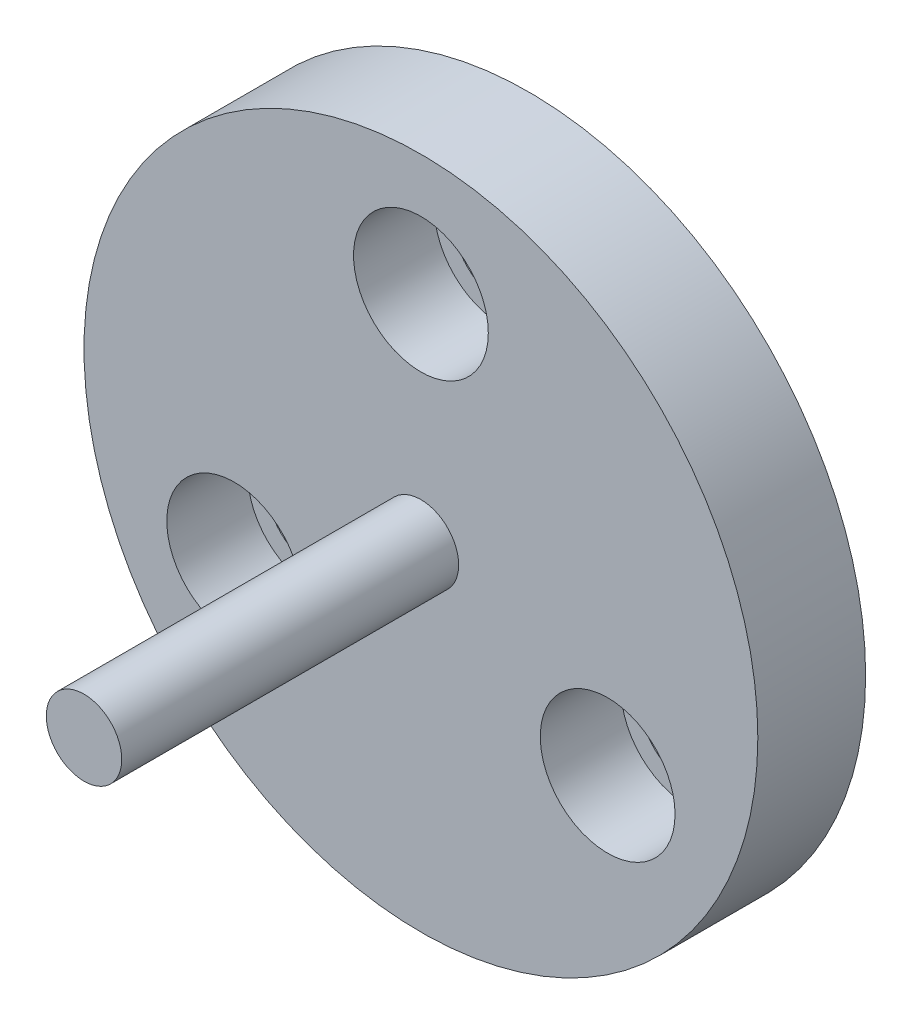
ISO-10303-21;
HEADER;
FILE_DESCRIPTION(('STEP AP214'),'2;1');
FILE_NAME('part.step','',(''),(''),'','','');
FILE_SCHEMA(('AUTOMOTIVE_DESIGN { 1 0 10303 214 1 1 1 1 }'));
ENDSEC;
DATA;
#1=APPLICATION_CONTEXT('core data for automotive mechanical design processes');
#2=APPLICATION_PROTOCOL_DEFINITION('international standard','automotive_design',2000,#1);
#3=PRODUCT_CONTEXT('',#1,'mechanical');
#4=PRODUCT('Part','Part','',(#3));
#5=PRODUCT_RELATED_PRODUCT_CATEGORY('part','',(#4));
#6=PRODUCT_DEFINITION_FORMATION('','',#4);
#7=PRODUCT_DEFINITION_CONTEXT('part definition',#1,'design');
#8=PRODUCT_DEFINITION('design','',#6,#7);
#9=PRODUCT_DEFINITION_SHAPE('','',#8);
#10=(LENGTH_UNIT() NAMED_UNIT(*) SI_UNIT(.MILLI.,.METRE.));
#11=(NAMED_UNIT(*) PLANE_ANGLE_UNIT() SI_UNIT($,.RADIAN.));
#12=(NAMED_UNIT(*) SI_UNIT($,.STERADIAN.) SOLID_ANGLE_UNIT());
#13=UNCERTAINTY_MEASURE_WITH_UNIT(LENGTH_MEASURE(1.E-05),#10,'distance_accuracy_value','');
#14=(GEOMETRIC_REPRESENTATION_CONTEXT(3) GLOBAL_UNCERTAINTY_ASSIGNED_CONTEXT((#13)) GLOBAL_UNIT_ASSIGNED_CONTEXT((#10,
#11,#12)) REPRESENTATION_CONTEXT('',''));
#15=CARTESIAN_POINT('',(0.,0.,0.));
#16=DIRECTION('',(0.,0.,1.));
#17=DIRECTION('',(1.,0.,0.));
#18=AXIS2_PLACEMENT_3D('',#15,#16,#17);
#19=CARTESIAN_POINT('',(-6.92820323027551,-4.,4.));
#20=DIRECTION('',(0.,0.,-1.));
#21=DIRECTION('',(-1.,0.,0.));
#22=AXIS2_PLACEMENT_3D('',#19,#20,#21);
#23=CYLINDRICAL_SURFACE('',#22,1.8);
#24=CARTESIAN_POINT('',(-6.92820323027551,-4.,0.));
#25=DIRECTION('',(0.,0.,1.));
#26=DIRECTION('',(1.,0.,0.));
#27=AXIS2_PLACEMENT_3D('',#24,#25,#26);
#28=CIRCLE('',#27,1.8);
#29=CARTESIAN_POINT('',(-5.12820323027551,-4.,0.));
#30=VERTEX_POINT('',#29);
#31=EDGE_CURVE('E78',#30,#30,#28,.T.);
#32=ORIENTED_EDGE('',*,*,#31,.F.);
#33=EDGE_LOOP('',(#32));
#34=FACE_BOUND('',#33,.T.);
#35=CARTESIAN_POINT('',(-6.92820323027551,-4.,1.));
#36=DIRECTION('',(0.,0.,1.));
#37=DIRECTION('',(1.,0.,0.));
#38=AXIS2_PLACEMENT_3D('',#35,#36,#37);
#39=CIRCLE('',#38,1.8);
#40=CARTESIAN_POINT('',(-5.12820323027551,-4.,1.));
#41=VERTEX_POINT('',#40);
#42=EDGE_CURVE('E69',#41,#41,#39,.T.);
#43=ORIENTED_EDGE('',*,*,#42,.T.);
#44=EDGE_LOOP('',(#43));
#45=FACE_BOUND('',#44,.T.);
#46=ADVANCED_FACE('F65',(#34,#45),#23,.F.);
#47=CARTESIAN_POINT('',(6.92820323027551,-4.,4.));
#48=DIRECTION('',(0.,0.,-1.));
#49=DIRECTION('',(-1.,0.,0.));
#50=AXIS2_PLACEMENT_3D('',#47,#48,#49);
#51=CYLINDRICAL_SURFACE('',#50,1.8);
#52=CARTESIAN_POINT('',(6.92820323027551,-4.,0.));
#53=DIRECTION('',(0.,0.,1.));
#54=DIRECTION('',(1.,0.,0.));
#55=AXIS2_PLACEMENT_3D('',#52,#53,#54);
#56=CIRCLE('',#55,1.8);
#57=CARTESIAN_POINT('',(8.72820323027551,-4.,0.));
#58=VERTEX_POINT('',#57);
#59=EDGE_CURVE('E95',#58,#58,#56,.T.);
#60=ORIENTED_EDGE('',*,*,#59,.F.);
#61=EDGE_LOOP('',(#60));
#62=FACE_BOUND('',#61,.T.);
#63=CARTESIAN_POINT('',(6.92820323027551,-4.,1.));
#64=DIRECTION('',(0.,0.,1.));
#65=DIRECTION('',(1.,0.,0.));
#66=AXIS2_PLACEMENT_3D('',#63,#64,#65);
#67=CIRCLE('',#66,1.8);
#68=CARTESIAN_POINT('',(8.72820323027551,-4.,1.));
#69=VERTEX_POINT('',#68);
#70=EDGE_CURVE('E85',#69,#69,#67,.T.);
#71=ORIENTED_EDGE('',*,*,#70,.T.);
#72=EDGE_LOOP('',(#71));
#73=FACE_BOUND('',#72,.T.);
#74=ADVANCED_FACE('F157',(#62,#73),#51,.F.);
#75=CARTESIAN_POINT('',(0.,8.,4.));
#76=DIRECTION('',(0.,0.,-1.));
#77=DIRECTION('',(-1.,0.,0.));
#78=AXIS2_PLACEMENT_3D('',#75,#76,#77);
#79=CYLINDRICAL_SURFACE('',#78,1.8);
#80=CARTESIAN_POINT('',(0.,8.,0.));
#81=DIRECTION('',(0.,0.,1.));
#82=DIRECTION('',(1.,0.,0.));
#83=AXIS2_PLACEMENT_3D('',#80,#81,#82);
#84=CIRCLE('',#83,1.8);
#85=CARTESIAN_POINT('',(1.8,8.,0.));
#86=VERTEX_POINT('',#85);
#87=EDGE_CURVE('E91',#86,#86,#84,.T.);
#88=ORIENTED_EDGE('',*,*,#87,.F.);
#89=EDGE_LOOP('',(#88));
#90=FACE_BOUND('',#89,.T.);
#91=CARTESIAN_POINT('',(0.,8.,1.));
#92=DIRECTION('',(0.,0.,1.));
#93=DIRECTION('',(1.,0.,0.));
#94=AXIS2_PLACEMENT_3D('',#91,#92,#93);
#95=CIRCLE('',#94,1.8);
#96=CARTESIAN_POINT('',(1.8,8.,1.));
#97=VERTEX_POINT('',#96);
#98=EDGE_CURVE('E83',#97,#97,#95,.T.);
#99=ORIENTED_EDGE('',*,*,#98,.T.);
#100=EDGE_LOOP('',(#99));
#101=FACE_BOUND('',#100,.T.);
#102=ADVANCED_FACE('F163',(#90,#101),#79,.F.);
#103=CARTESIAN_POINT('',(0.,0.,0.));
#104=DIRECTION('',(0.,0.,1.));
#105=DIRECTION('',(1.,0.,0.));
#106=AXIS2_PLACEMENT_3D('',#103,#104,#105);
#107=PLANE('',#106);
#108=CARTESIAN_POINT('',(0.,0.,0.));
#109=DIRECTION('',(0.,0.,1.));
#110=DIRECTION('',(1.,0.,0.));
#111=AXIS2_PLACEMENT_3D('',#108,#109,#110);
#112=CIRCLE('',#111,12.5);
#113=CARTESIAN_POINT('',(12.5,0.,0.));
#114=VERTEX_POINT('',#113);
#115=EDGE_CURVE('E73',#114,#114,#112,.T.);
#116=ORIENTED_EDGE('',*,*,#115,.F.);
#117=EDGE_LOOP('',(#116));
#118=FACE_BOUND('',#117,.T.);
#119=ORIENTED_EDGE('',*,*,#31,.T.);
#120=EDGE_LOOP('',(#119));
#121=FACE_BOUND('',#120,.T.);
#122=ORIENTED_EDGE('',*,*,#59,.T.);
#123=EDGE_LOOP('',(#122));
#124=FACE_BOUND('',#123,.T.);
#125=ORIENTED_EDGE('',*,*,#87,.T.);
#126=EDGE_LOOP('',(#125));
#127=FACE_BOUND('',#126,.T.);
#128=ADVANCED_FACE('F67',(#118,#121,#124,#127),#107,.F.);
#129=CARTESIAN_POINT('',(0.,0.,4.));
#130=DIRECTION('',(0.,0.,-1.));
#131=DIRECTION('',(-1.,0.,0.));
#132=AXIS2_PLACEMENT_3D('',#129,#130,#131);
#133=CYLINDRICAL_SURFACE('',#132,12.5);
#134=CARTESIAN_POINT('',(0.,0.,4.));
#135=DIRECTION('',(0.,0.,1.));
#136=DIRECTION('',(1.,0.,0.));
#137=AXIS2_PLACEMENT_3D('',#134,#135,#136);
#138=CIRCLE('',#137,12.5);
#139=CARTESIAN_POINT('',(12.5,0.,4.));
#140=VERTEX_POINT('',#139);
#141=EDGE_CURVE('E12',#140,#140,#138,.T.);
#142=ORIENTED_EDGE('',*,*,#141,.F.);
#143=EDGE_LOOP('',(#142));
#144=FACE_BOUND('',#143,.T.);
#145=ORIENTED_EDGE('',*,*,#115,.T.);
#146=EDGE_LOOP('',(#145));
#147=FACE_BOUND('',#146,.T.);
#148=ADVANCED_FACE('F138',(#144,#147),#133,.T.);
#149=CARTESIAN_POINT('',(0.,0.,4.));
#150=DIRECTION('',(0.,0.,1.));
#151=DIRECTION('',(1.,0.,0.));
#152=AXIS2_PLACEMENT_3D('',#149,#150,#151);
#153=PLANE('',#152);
#154=CARTESIAN_POINT('',(0.,0.,4.));
#155=DIRECTION('',(0.,0.,1.));
#156=DIRECTION('',(1.,0.,0.));
#157=AXIS2_PLACEMENT_3D('',#154,#155,#156);
#158=CIRCLE('',#157,1.4);
#159=CARTESIAN_POINT('',(1.4,0.,4.));
#160=VERTEX_POINT('',#159);
#161=EDGE_CURVE('E119',#160,#160,#158,.T.);
#162=ORIENTED_EDGE('',*,*,#161,.F.);
#163=EDGE_LOOP('',(#162));
#164=FACE_BOUND('',#163,.T.);
#165=CARTESIAN_POINT('',(0.,8.,4.));
#166=DIRECTION('',(0.,0.,1.));
#167=DIRECTION('',(1.,0.,0.));
#168=AXIS2_PLACEMENT_3D('',#165,#166,#167);
#169=CIRCLE('',#168,2.5);
#170=CARTESIAN_POINT('',(2.5,8.,4.));
#171=VERTEX_POINT('',#170);
#172=EDGE_CURVE('E112',#171,#171,#169,.T.);
#173=ORIENTED_EDGE('',*,*,#172,.F.);
#174=EDGE_LOOP('',(#173));
#175=FACE_BOUND('',#174,.T.);
#176=CARTESIAN_POINT('',(6.92820323027551,-4.,4.));
#177=DIRECTION('',(0.,0.,1.));
#178=DIRECTION('',(1.,0.,0.));
#179=AXIS2_PLACEMENT_3D('',#176,#177,#178);
#180=CIRCLE('',#179,2.5);
#181=CARTESIAN_POINT('',(9.42820323027551,-4.,4.));
#182=VERTEX_POINT('',#181);
#183=EDGE_CURVE('E109',#182,#182,#180,.T.);
#184=ORIENTED_EDGE('',*,*,#183,.F.);
#185=EDGE_LOOP('',(#184));
#186=FACE_BOUND('',#185,.T.);
#187=CARTESIAN_POINT('',(-6.92820323027551,-4.,4.));
#188=DIRECTION('',(0.,0.,1.));
#189=DIRECTION('',(1.,0.,0.));
#190=AXIS2_PLACEMENT_3D('',#187,#188,#189);
#191=CIRCLE('',#190,2.5);
#192=CARTESIAN_POINT('',(-4.42820323027551,-4.,4.));
#193=VERTEX_POINT('',#192);
#194=EDGE_CURVE('E101',#193,#193,#191,.T.);
#195=ORIENTED_EDGE('',*,*,#194,.F.);
#196=EDGE_LOOP('',(#195));
#197=FACE_BOUND('',#196,.T.);
#198=ORIENTED_EDGE('',*,*,#141,.T.);
#199=EDGE_LOOP('',(#198));
#200=FACE_BOUND('',#199,.T.);
#201=ADVANCED_FACE('F134',(#164,#175,#186,#197,#200),#153,.T.);
#202=CARTESIAN_POINT('',(-6.92820323027551,-4.,-7.07106781186548));
#203=DIRECTION('',(0.,0.,1.));
#204=DIRECTION('',(1.,0.,0.));
#205=AXIS2_PLACEMENT_3D('',#202,#203,#204);
#206=CYLINDRICAL_SURFACE('',#205,2.5);
#207=CARTESIAN_POINT('',(-6.92820323027551,-4.,1.));
#208=DIRECTION('',(0.,0.,1.));
#209=DIRECTION('',(1.,0.,0.));
#210=AXIS2_PLACEMENT_3D('',#207,#208,#209);
#211=CIRCLE('',#210,2.5);
#212=CARTESIAN_POINT('',(-4.42820323027551,-4.,1.));
#213=VERTEX_POINT('',#212);
#214=EDGE_CURVE('E105',#213,#213,#211,.F.);
#215=ORIENTED_EDGE('',*,*,#214,.T.);
#216=EDGE_LOOP('',(#215));
#217=FACE_BOUND('',#216,.T.);
#218=ORIENTED_EDGE('',*,*,#194,.T.);
#219=EDGE_LOOP('',(#218));
#220=FACE_BOUND('',#219,.T.);
#221=ADVANCED_FACE('F137',(#217,#220),#206,.F.);
#222=CARTESIAN_POINT('',(0.,0.,1.));
#223=DIRECTION('',(0.,0.,1.));
#224=DIRECTION('',(1.,0.,0.));
#225=AXIS2_PLACEMENT_3D('',#222,#223,#224);
#226=PLANE('',#225);
#227=ORIENTED_EDGE('',*,*,#42,.F.);
#228=EDGE_LOOP('',(#227));
#229=FACE_BOUND('',#228,.T.);
#230=ORIENTED_EDGE('',*,*,#214,.F.);
#231=EDGE_LOOP('',(#230));
#232=FACE_BOUND('',#231,.T.);
#233=ADVANCED_FACE('F146',(#229,#232),#226,.T.);
#234=CARTESIAN_POINT('',(6.92820323027551,-4.,-7.07106781186548));
#235=DIRECTION('',(0.,0.,1.));
#236=DIRECTION('',(1.,0.,0.));
#237=AXIS2_PLACEMENT_3D('',#234,#235,#236);
#238=CYLINDRICAL_SURFACE('',#237,2.5);
#239=CARTESIAN_POINT('',(6.92820323027551,-4.,1.));
#240=DIRECTION('',(0.,0.,1.));
#241=DIRECTION('',(1.,0.,0.));
#242=AXIS2_PLACEMENT_3D('',#239,#240,#241);
#243=CIRCLE('',#242,2.5);
#244=CARTESIAN_POINT('',(9.42820323027551,-4.,1.));
#245=VERTEX_POINT('',#244);
#246=EDGE_CURVE('E104',#245,#245,#243,.F.);
#247=ORIENTED_EDGE('',*,*,#246,.T.);
#248=EDGE_LOOP('',(#247));
#249=FACE_BOUND('',#248,.T.);
#250=ORIENTED_EDGE('',*,*,#183,.T.);
#251=EDGE_LOOP('',(#250));
#252=FACE_BOUND('',#251,.T.);
#253=ADVANCED_FACE('F152',(#249,#252),#238,.F.);
#254=CARTESIAN_POINT('',(0.,0.,1.));
#255=DIRECTION('',(0.,0.,1.));
#256=DIRECTION('',(1.,0.,0.));
#257=AXIS2_PLACEMENT_3D('',#254,#255,#256);
#258=PLANE('',#257);
#259=ORIENTED_EDGE('',*,*,#70,.F.);
#260=EDGE_LOOP('',(#259));
#261=FACE_BOUND('',#260,.T.);
#262=ORIENTED_EDGE('',*,*,#246,.F.);
#263=EDGE_LOOP('',(#262));
#264=FACE_BOUND('',#263,.T.);
#265=ADVANCED_FACE('F198',(#261,#264),#258,.T.);
#266=CARTESIAN_POINT('',(0.,8.,-7.07106781186548));
#267=DIRECTION('',(0.,0.,1.));
#268=DIRECTION('',(1.,0.,0.));
#269=AXIS2_PLACEMENT_3D('',#266,#267,#268);
#270=CYLINDRICAL_SURFACE('',#269,2.5);
#271=CARTESIAN_POINT('',(0.,8.,1.));
#272=DIRECTION('',(0.,0.,1.));
#273=DIRECTION('',(1.,0.,0.));
#274=AXIS2_PLACEMENT_3D('',#271,#272,#273);
#275=CIRCLE('',#274,2.5);
#276=CARTESIAN_POINT('',(2.5,8.,1.));
#277=VERTEX_POINT('',#276);
#278=EDGE_CURVE('E86',#277,#277,#275,.F.);
#279=ORIENTED_EDGE('',*,*,#278,.T.);
#280=EDGE_LOOP('',(#279));
#281=FACE_BOUND('',#280,.T.);
#282=ORIENTED_EDGE('',*,*,#172,.T.);
#283=EDGE_LOOP('',(#282));
#284=FACE_BOUND('',#283,.T.);
#285=ADVANCED_FACE('F192',(#281,#284),#270,.F.);
#286=CARTESIAN_POINT('',(0.,0.,1.));
#287=DIRECTION('',(0.,0.,1.));
#288=DIRECTION('',(1.,0.,0.));
#289=AXIS2_PLACEMENT_3D('',#286,#287,#288);
#290=PLANE('',#289);
#291=ORIENTED_EDGE('',*,*,#98,.F.);
#292=EDGE_LOOP('',(#291));
#293=FACE_BOUND('',#292,.T.);
#294=ORIENTED_EDGE('',*,*,#278,.F.);
#295=EDGE_LOOP('',(#294));
#296=FACE_BOUND('',#295,.T.);
#297=ADVANCED_FACE('F130',(#293,#296),#290,.T.);
#298=CARTESIAN_POINT('',(0.,0.,16.5));
#299=DIRECTION('',(0.,0.,-1.));
#300=DIRECTION('',(-1.,0.,0.));
#301=AXIS2_PLACEMENT_3D('',#298,#299,#300);
#302=CYLINDRICAL_SURFACE('',#301,1.4);
#303=CARTESIAN_POINT('',(0.,0.,16.5));
#304=DIRECTION('',(0.,0.,1.));
#305=DIRECTION('',(1.,0.,0.));
#306=AXIS2_PLACEMENT_3D('',#303,#304,#305);
#307=CIRCLE('',#306,1.4);
#308=CARTESIAN_POINT('',(1.4,0.,16.5));
#309=VERTEX_POINT('',#308);
#310=EDGE_CURVE('E108',#309,#309,#307,.T.);
#311=ORIENTED_EDGE('',*,*,#310,.F.);
#312=EDGE_LOOP('',(#311));
#313=FACE_BOUND('',#312,.T.);
#314=ORIENTED_EDGE('',*,*,#161,.T.);
#315=EDGE_LOOP('',(#314));
#316=FACE_BOUND('',#315,.T.);
#317=ADVANCED_FACE('F127',(#313,#316),#302,.T.);
#318=CARTESIAN_POINT('',(0.,0.,16.5));
#319=DIRECTION('',(0.,0.,1.));
#320=DIRECTION('',(1.,0.,0.));
#321=AXIS2_PLACEMENT_3D('',#318,#319,#320);
#322=PLANE('',#321);
#323=ORIENTED_EDGE('',*,*,#310,.T.);
#324=EDGE_LOOP('',(#323));
#325=FACE_BOUND('',#324,.T.);
#326=ADVANCED_FACE('F125',(#325),#322,.T.);
#327=CLOSED_SHELL('',(#46,#74,#102,#128,#148,#201,#221,#233,#253,#265,#285,#297,#317,#326));
#328=MANIFOLD_SOLID_BREP('B2',#327);
#329=ADVANCED_BREP_SHAPE_REPRESENTATION('',(#18,#328),#14);
#330=SHAPE_DEFINITION_REPRESENTATION(#9,#329);
ENDSEC;
END-ISO-10303-21;
